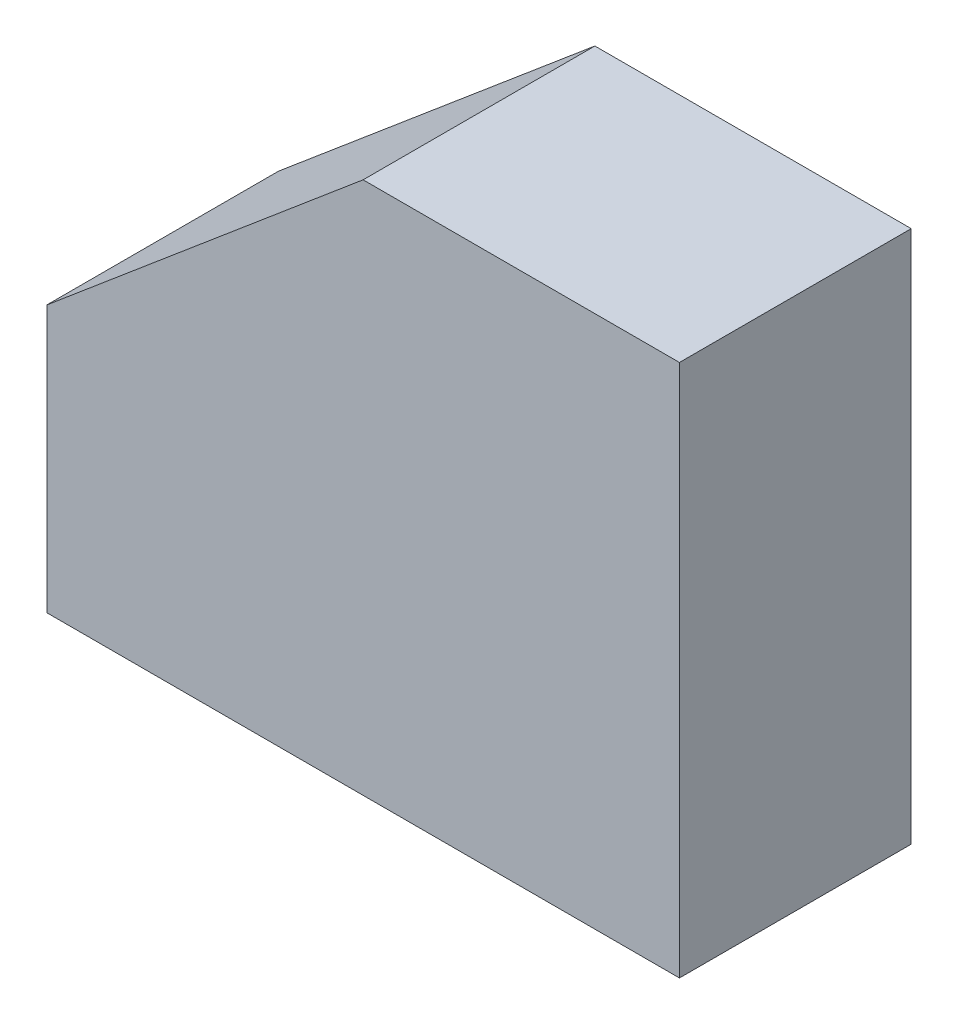
ISO-10303-21;
HEADER;
FILE_DESCRIPTION(('STEP AP214'),'2;1');
FILE_NAME('part.step','',(''),(''),'','','');
FILE_SCHEMA(('AUTOMOTIVE_DESIGN { 1 0 10303 214 1 1 1 1 }'));
ENDSEC;
DATA;
#1=APPLICATION_CONTEXT('core data for automotive mechanical design processes');
#2=APPLICATION_PROTOCOL_DEFINITION('international standard','automotive_design',2000,#1);
#3=PRODUCT_CONTEXT('',#1,'mechanical');
#4=PRODUCT('Part','Part','',(#3));
#5=PRODUCT_RELATED_PRODUCT_CATEGORY('part','',(#4));
#6=PRODUCT_DEFINITION_FORMATION('','',#4);
#7=PRODUCT_DEFINITION_CONTEXT('part definition',#1,'design');
#8=PRODUCT_DEFINITION('design','',#6,#7);
#9=PRODUCT_DEFINITION_SHAPE('','',#8);
#10=(LENGTH_UNIT() NAMED_UNIT(*) SI_UNIT(.MILLI.,.METRE.));
#11=(NAMED_UNIT(*) PLANE_ANGLE_UNIT() SI_UNIT($,.RADIAN.));
#12=(NAMED_UNIT(*) SI_UNIT($,.STERADIAN.) SOLID_ANGLE_UNIT());
#13=UNCERTAINTY_MEASURE_WITH_UNIT(LENGTH_MEASURE(1.E-05),#10,'distance_accuracy_value','');
#14=(GEOMETRIC_REPRESENTATION_CONTEXT(3) GLOBAL_UNCERTAINTY_ASSIGNED_CONTEXT((#13)) GLOBAL_UNIT_ASSIGNED_CONTEXT((#10,
#11,#12)) REPRESENTATION_CONTEXT('',''));
#15=CARTESIAN_POINT('',(0.,0.,0.));
#16=DIRECTION('',(0.,0.,1.));
#17=DIRECTION('',(1.,0.,0.));
#18=AXIS2_PLACEMENT_3D('',#15,#16,#17);
#19=CARTESIAN_POINT('',(0.,0.,2.5));
#20=DIRECTION('',(1.,0.,0.));
#21=DIRECTION('',(0.,0.,-1.));
#22=AXIS2_PLACEMENT_3D('',#19,#20,#21);
#23=PLANE('',#22);
#24=DIRECTION('',(0.,-1.,0.));
#25=VECTOR('',#24,1.);
#26=CARTESIAN_POINT('',(0.,0.,2.5));
#27=LINE('',#26,#25);
#28=CARTESIAN_POINT('',(0.,5.74995759613368,2.5));
#29=VERTEX_POINT('',#28);
#30=CARTESIAN_POINT('',(0.,0.,2.5));
#31=VERTEX_POINT('',#30);
#32=EDGE_CURVE('E78',#29,#31,#27,.T.);
#33=ORIENTED_EDGE('',*,*,#32,.F.);
#34=DIRECTION('',(0.,0.,-1.));
#35=VECTOR('',#34,1.);
#36=CARTESIAN_POINT('',(0.,5.74995759613368,7.5));
#37=LINE('',#36,#35);
#38=CARTESIAN_POINT('',(0.,5.74995759613368,-2.5));
#39=VERTEX_POINT('',#38);
#40=EDGE_CURVE('E89',#29,#39,#37,.T.);
#41=ORIENTED_EDGE('',*,*,#40,.T.);
#42=DIRECTION('',(0.,-1.,0.));
#43=VECTOR('',#42,1.);
#44=CARTESIAN_POINT('',(0.,0.,-2.5));
#45=LINE('',#44,#43);
#46=CARTESIAN_POINT('',(0.,0.,-2.5));
#47=VERTEX_POINT('',#46);
#48=EDGE_CURVE('E97',#39,#47,#45,.T.);
#49=ORIENTED_EDGE('',*,*,#48,.T.);
#50=DIRECTION('',(0.,0.,-1.));
#51=VECTOR('',#50,1.);
#52=CARTESIAN_POINT('',(0.,0.,2.5));
#53=LINE('',#52,#51);
#54=EDGE_CURVE('E11',#31,#47,#53,.T.);
#55=ORIENTED_EDGE('',*,*,#54,.F.);
#56=EDGE_LOOP('',(#33,#41,#49,#55));
#57=FACE_BOUND('',#56,.T.);
#58=ADVANCED_FACE('F33',(#57),#23,.F.);
#59=CARTESIAN_POINT('',(0.,0.,2.5));
#60=DIRECTION('',(0.,1.,0.));
#61=DIRECTION('',(0.,0.,1.));
#62=AXIS2_PLACEMENT_3D('',#59,#60,#61);
#63=PLANE('',#62);
#64=DIRECTION('',(1.,0.,0.));
#65=VECTOR('',#64,1.);
#66=CARTESIAN_POINT('',(0.,0.,-2.5));
#67=LINE('',#66,#65);
#68=CARTESIAN_POINT('',(13.6484570721336,0.,-2.5));
#69=VERTEX_POINT('',#68);
#70=EDGE_CURVE('E102',#47,#69,#67,.T.);
#71=ORIENTED_EDGE('',*,*,#70,.T.);
#72=DIRECTION('',(0.,0.,-1.));
#73=VECTOR('',#72,1.);
#74=CARTESIAN_POINT('',(13.6484570721336,0.,2.5));
#75=LINE('',#74,#73);
#76=CARTESIAN_POINT('',(13.6484570721336,0.,2.5));
#77=VERTEX_POINT('',#76);
#78=EDGE_CURVE('E40',#77,#69,#75,.T.);
#79=ORIENTED_EDGE('',*,*,#78,.F.);
#80=DIRECTION('',(1.,0.,0.));
#81=VECTOR('',#80,1.);
#82=CARTESIAN_POINT('',(0.,0.,2.5));
#83=LINE('',#82,#81);
#84=EDGE_CURVE('E120',#31,#77,#83,.T.);
#85=ORIENTED_EDGE('',*,*,#84,.F.);
#86=ORIENTED_EDGE('',*,*,#54,.T.);
#87=EDGE_LOOP('',(#71,#79,#85,#86));
#88=FACE_BOUND('',#87,.T.);
#89=ADVANCED_FACE('F125',(#88),#63,.F.);
#90=CARTESIAN_POINT('',(13.6484570721336,0.,2.5));
#91=DIRECTION('',(-1.,0.,0.));
#92=DIRECTION('',(0.,0.,1.));
#93=AXIS2_PLACEMENT_3D('',#90,#91,#92);
#94=PLANE('',#93);
#95=DIRECTION('',(0.,1.,0.));
#96=VECTOR('',#95,1.);
#97=CARTESIAN_POINT('',(13.6484570721336,0.,-2.5));
#98=LINE('',#97,#96);
#99=CARTESIAN_POINT('',(13.6484570721336,11.4999151922674,-2.5));
#100=VERTEX_POINT('',#99);
#101=EDGE_CURVE('E73',#69,#100,#98,.T.);
#102=ORIENTED_EDGE('',*,*,#101,.T.);
#103=DIRECTION('',(0.,0.,-1.));
#104=VECTOR('',#103,1.);
#105=CARTESIAN_POINT('',(13.6484570721336,11.4999151922674,2.5));
#106=LINE('',#105,#104);
#107=CARTESIAN_POINT('',(13.6484570721336,11.4999151922674,2.5));
#108=VERTEX_POINT('',#107);
#109=EDGE_CURVE('E113',#108,#100,#106,.T.);
#110=ORIENTED_EDGE('',*,*,#109,.F.);
#111=DIRECTION('',(0.,1.,0.));
#112=VECTOR('',#111,1.);
#113=CARTESIAN_POINT('',(13.6484570721336,0.,2.5));
#114=LINE('',#113,#112);
#115=EDGE_CURVE('E56',#77,#108,#114,.T.);
#116=ORIENTED_EDGE('',*,*,#115,.F.);
#117=ORIENTED_EDGE('',*,*,#78,.T.);
#118=EDGE_LOOP('',(#102,#110,#116,#117));
#119=FACE_BOUND('',#118,.T.);
#120=ADVANCED_FACE('F115',(#119),#94,.F.);
#121=CARTESIAN_POINT('',(0.,11.4999151922674,2.5));
#122=DIRECTION('',(0.,-1.,0.));
#123=DIRECTION('',(0.,0.,-1.));
#124=AXIS2_PLACEMENT_3D('',#121,#122,#123);
#125=PLANE('',#124);
#126=DIRECTION('',(-1.,0.,0.));
#127=VECTOR('',#126,1.);
#128=CARTESIAN_POINT('',(0.,11.4999151922674,-2.5));
#129=LINE('',#128,#127);
#130=CARTESIAN_POINT('',(6.82422853606681,11.4999151922674,-2.5));
#131=VERTEX_POINT('',#130);
#132=EDGE_CURVE('E111',#100,#131,#129,.T.);
#133=ORIENTED_EDGE('',*,*,#132,.T.);
#134=DIRECTION('',(0.,0.,-1.));
#135=VECTOR('',#134,1.);
#136=CARTESIAN_POINT('',(6.82422853606681,11.4999151922674,7.5));
#137=LINE('',#136,#135);
#138=CARTESIAN_POINT('',(6.82422853606681,11.4999151922674,2.5));
#139=VERTEX_POINT('',#138);
#140=EDGE_CURVE('E47',#139,#131,#137,.T.);
#141=ORIENTED_EDGE('',*,*,#140,.F.);
#142=DIRECTION('',(-1.,0.,0.));
#143=VECTOR('',#142,1.);
#144=CARTESIAN_POINT('',(0.,11.4999151922674,2.5));
#145=LINE('',#144,#143);
#146=EDGE_CURVE('E107',#108,#139,#145,.T.);
#147=ORIENTED_EDGE('',*,*,#146,.F.);
#148=ORIENTED_EDGE('',*,*,#109,.T.);
#149=EDGE_LOOP('',(#133,#141,#147,#148));
#150=FACE_BOUND('',#149,.T.);
#151=ADVANCED_FACE('F118',(#150),#125,.F.);
#152=CARTESIAN_POINT('',(0.,11.4999151922674,2.5));
#153=DIRECTION('',(0.,0.,-1.));
#154=DIRECTION('',(-1.,0.,0.));
#155=AXIS2_PLACEMENT_3D('',#152,#153,#154);
#156=PLANE('',#155);
#157=ORIENTED_EDGE('',*,*,#146,.T.);
#158=DIRECTION('',(-0.764732341955619,-0.64434807764676,0.));
#159=VECTOR('',#158,1.);
#160=CARTESIAN_POINT('',(2.83331353844022,8.13725055041865,2.5));
#161=LINE('',#160,#159);
#162=EDGE_CURVE('E99',#139,#29,#161,.T.);
#163=ORIENTED_EDGE('',*,*,#162,.T.);
#164=ORIENTED_EDGE('',*,*,#32,.T.);
#165=ORIENTED_EDGE('',*,*,#84,.T.);
#166=ORIENTED_EDGE('',*,*,#115,.T.);
#167=EDGE_LOOP('',(#157,#163,#164,#165,#166));
#168=FACE_BOUND('',#167,.T.);
#169=ADVANCED_FACE('F124',(#168),#156,.F.);
#170=CARTESIAN_POINT('',(0.,11.4999151922674,-2.5));
#171=DIRECTION('',(0.,0.,-1.));
#172=DIRECTION('',(-1.,0.,0.));
#173=AXIS2_PLACEMENT_3D('',#170,#171,#172);
#174=PLANE('',#173);
#175=DIRECTION('',(-0.764732341955619,-0.64434807764676,0.));
#176=VECTOR('',#175,1.);
#177=CARTESIAN_POINT('',(6.82422853606681,11.4999151922674,-2.5));
#178=LINE('',#177,#176);
#179=EDGE_CURVE('E86',#131,#39,#178,.T.);
#180=ORIENTED_EDGE('',*,*,#179,.F.);
#181=ORIENTED_EDGE('',*,*,#132,.F.);
#182=ORIENTED_EDGE('',*,*,#101,.F.);
#183=ORIENTED_EDGE('',*,*,#70,.F.);
#184=ORIENTED_EDGE('',*,*,#48,.F.);
#185=EDGE_LOOP('',(#180,#181,#182,#183,#184));
#186=FACE_BOUND('',#185,.T.);
#187=ADVANCED_FACE('F101',(#186),#174,.T.);
#188=CARTESIAN_POINT('',(6.82422853606681,11.4999151922674,7.5));
#189=DIRECTION('',(0.64434807764676,-0.764732341955619,0.));
#190=DIRECTION('',(0.764732341955619,0.64434807764676,0.));
#191=AXIS2_PLACEMENT_3D('',#188,#189,#190);
#192=PLANE('',#191);
#193=ORIENTED_EDGE('',*,*,#140,.T.);
#194=ORIENTED_EDGE('',*,*,#179,.T.);
#195=ORIENTED_EDGE('',*,*,#40,.F.);
#196=ORIENTED_EDGE('',*,*,#162,.F.);
#197=EDGE_LOOP('',(#193,#194,#195,#196));
#198=FACE_BOUND('',#197,.T.);
#199=ADVANCED_FACE('F88',(#198),#192,.F.);
#200=CLOSED_SHELL('',(#58,#89,#120,#151,#169,#187,#199));
#201=MANIFOLD_SOLID_BREP('B2',#200);
#202=ADVANCED_BREP_SHAPE_REPRESENTATION('',(#18,#201),#14);
#203=SHAPE_DEFINITION_REPRESENTATION(#9,#202);
ENDSEC;
END-ISO-10303-21;
